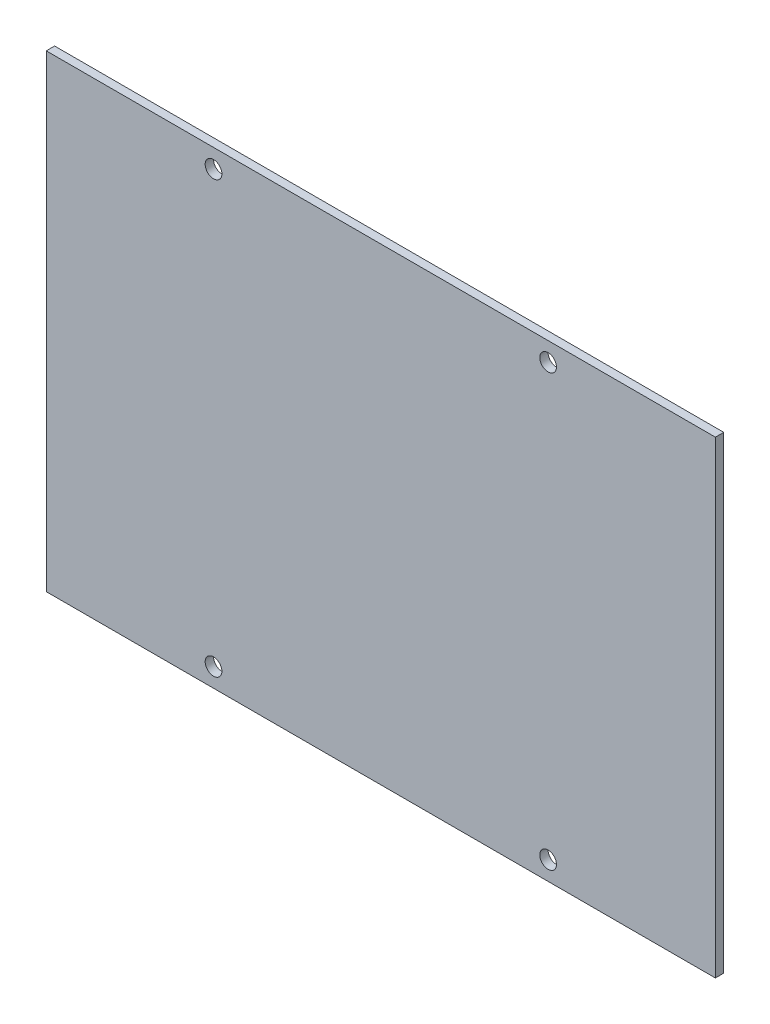
ISO-10303-21;
HEADER;
FILE_DESCRIPTION(('STEP AP214'),'2;1');
FILE_NAME('part.step','',(''),(''),'','','');
FILE_SCHEMA(('AUTOMOTIVE_DESIGN { 1 0 10303 214 1 1 1 1 }'));
ENDSEC;
DATA;
#1=APPLICATION_CONTEXT('core data for automotive mechanical design processes');
#2=APPLICATION_PROTOCOL_DEFINITION('international standard','automotive_design',2000,#1);
#3=PRODUCT_CONTEXT('',#1,'mechanical');
#4=PRODUCT('Part','Part','',(#3));
#5=PRODUCT_RELATED_PRODUCT_CATEGORY('part','',(#4));
#6=PRODUCT_DEFINITION_FORMATION('','',#4);
#7=PRODUCT_DEFINITION_CONTEXT('part definition',#1,'design');
#8=PRODUCT_DEFINITION('design','',#6,#7);
#9=PRODUCT_DEFINITION_SHAPE('','',#8);
#10=(LENGTH_UNIT() NAMED_UNIT(*) SI_UNIT(.MILLI.,.METRE.));
#11=(NAMED_UNIT(*) PLANE_ANGLE_UNIT() SI_UNIT($,.RADIAN.));
#12=(NAMED_UNIT(*) SI_UNIT($,.STERADIAN.) SOLID_ANGLE_UNIT());
#13=UNCERTAINTY_MEASURE_WITH_UNIT(LENGTH_MEASURE(1.E-05),#10,'distance_accuracy_value','');
#14=(GEOMETRIC_REPRESENTATION_CONTEXT(3) GLOBAL_UNCERTAINTY_ASSIGNED_CONTEXT((#13)) GLOBAL_UNIT_ASSIGNED_CONTEXT((#10,
#11,#12)) REPRESENTATION_CONTEXT('',''));
#15=CARTESIAN_POINT('',(0.,0.,0.));
#16=DIRECTION('',(0.,0.,1.));
#17=DIRECTION('',(1.,0.,0.));
#18=AXIS2_PLACEMENT_3D('',#15,#16,#17);
#19=CARTESIAN_POINT('',(0.,0.,2.));
#20=DIRECTION('',(1.,0.,0.));
#21=DIRECTION('',(0.,0.,-1.));
#22=AXIS2_PLACEMENT_3D('',#19,#20,#21);
#23=PLANE('',#22);
#24=DIRECTION('',(0.,-1.,0.));
#25=VECTOR('',#24,1.);
#26=CARTESIAN_POINT('',(0.,0.,0.));
#27=LINE('',#26,#25);
#28=CARTESIAN_POINT('',(0.,112.,0.));
#29=VERTEX_POINT('',#28);
#30=CARTESIAN_POINT('',(0.,0.,0.));
#31=VERTEX_POINT('',#30);
#32=EDGE_CURVE('E100',#29,#31,#27,.T.);
#33=ORIENTED_EDGE('',*,*,#32,.T.);
#34=DIRECTION('',(0.,0.,-1.));
#35=VECTOR('',#34,1.);
#36=CARTESIAN_POINT('',(0.,0.,2.));
#37=LINE('',#36,#35);
#38=CARTESIAN_POINT('',(0.,0.,2.));
#39=VERTEX_POINT('',#38);
#40=EDGE_CURVE('E11',#39,#31,#37,.T.);
#41=ORIENTED_EDGE('',*,*,#40,.F.);
#42=DIRECTION('',(0.,-1.,0.));
#43=VECTOR('',#42,1.);
#44=CARTESIAN_POINT('',(0.,0.,2.));
#45=LINE('',#44,#43);
#46=CARTESIAN_POINT('',(0.,112.,2.));
#47=VERTEX_POINT('',#46);
#48=EDGE_CURVE('E88',#47,#39,#45,.T.);
#49=ORIENTED_EDGE('',*,*,#48,.F.);
#50=DIRECTION('',(0.,0.,-1.));
#51=VECTOR('',#50,1.);
#52=CARTESIAN_POINT('',(0.,112.,2.));
#53=LINE('',#52,#51);
#54=EDGE_CURVE('E96',#47,#29,#53,.T.);
#55=ORIENTED_EDGE('',*,*,#54,.T.);
#56=EDGE_LOOP('',(#33,#41,#49,#55));
#57=FACE_BOUND('',#56,.T.);
#58=ADVANCED_FACE('F37',(#57),#23,.F.);
#59=CARTESIAN_POINT('',(0.,0.,2.));
#60=DIRECTION('',(0.,1.,0.));
#61=DIRECTION('',(0.,0.,1.));
#62=AXIS2_PLACEMENT_3D('',#59,#60,#61);
#63=PLANE('',#62);
#64=DIRECTION('',(1.,0.,0.));
#65=VECTOR('',#64,1.);
#66=CARTESIAN_POINT('',(0.,0.,0.));
#67=LINE('',#66,#65);
#68=CARTESIAN_POINT('',(160.,0.,0.));
#69=VERTEX_POINT('',#68);
#70=EDGE_CURVE('E92',#31,#69,#67,.T.);
#71=ORIENTED_EDGE('',*,*,#70,.T.);
#72=DIRECTION('',(0.,0.,-1.));
#73=VECTOR('',#72,1.);
#74=CARTESIAN_POINT('',(160.,0.,2.));
#75=LINE('',#74,#73);
#76=CARTESIAN_POINT('',(160.,0.,2.));
#77=VERTEX_POINT('',#76);
#78=EDGE_CURVE('E45',#77,#69,#75,.T.);
#79=ORIENTED_EDGE('',*,*,#78,.F.);
#80=DIRECTION('',(1.,0.,0.));
#81=VECTOR('',#80,1.);
#82=CARTESIAN_POINT('',(0.,0.,2.));
#83=LINE('',#82,#81);
#84=EDGE_CURVE('E83',#39,#77,#83,.T.);
#85=ORIENTED_EDGE('',*,*,#84,.F.);
#86=ORIENTED_EDGE('',*,*,#40,.T.);
#87=EDGE_LOOP('',(#71,#79,#85,#86));
#88=FACE_BOUND('',#87,.T.);
#89=ADVANCED_FACE('F91',(#88),#63,.F.);
#90=CARTESIAN_POINT('',(160.,0.,2.));
#91=DIRECTION('',(-1.,0.,0.));
#92=DIRECTION('',(0.,0.,1.));
#93=AXIS2_PLACEMENT_3D('',#90,#91,#92);
#94=PLANE('',#93);
#95=DIRECTION('',(0.,1.,0.));
#96=VECTOR('',#95,1.);
#97=CARTESIAN_POINT('',(160.,0.,0.));
#98=LINE('',#97,#96);
#99=CARTESIAN_POINT('',(160.,112.,0.));
#100=VERTEX_POINT('',#99);
#101=EDGE_CURVE('E70',#69,#100,#98,.T.);
#102=ORIENTED_EDGE('',*,*,#101,.T.);
#103=DIRECTION('',(0.,0.,-1.));
#104=VECTOR('',#103,1.);
#105=CARTESIAN_POINT('',(160.,112.,2.));
#106=LINE('',#105,#104);
#107=CARTESIAN_POINT('',(160.,112.,2.));
#108=VERTEX_POINT('',#107);
#109=EDGE_CURVE('E93',#108,#100,#106,.T.);
#110=ORIENTED_EDGE('',*,*,#109,.F.);
#111=DIRECTION('',(0.,1.,0.));
#112=VECTOR('',#111,1.);
#113=CARTESIAN_POINT('',(160.,0.,2.));
#114=LINE('',#113,#112);
#115=EDGE_CURVE('E86',#77,#108,#114,.T.);
#116=ORIENTED_EDGE('',*,*,#115,.F.);
#117=ORIENTED_EDGE('',*,*,#78,.T.);
#118=EDGE_LOOP('',(#102,#110,#116,#117));
#119=FACE_BOUND('',#118,.T.);
#120=ADVANCED_FACE('F94',(#119),#94,.F.);
#121=CARTESIAN_POINT('',(0.,112.,2.));
#122=DIRECTION('',(0.,-1.,0.));
#123=DIRECTION('',(0.,0.,-1.));
#124=AXIS2_PLACEMENT_3D('',#121,#122,#123);
#125=PLANE('',#124);
#126=DIRECTION('',(-1.,0.,0.));
#127=VECTOR('',#126,1.);
#128=CARTESIAN_POINT('',(0.,112.,0.));
#129=LINE('',#128,#127);
#130=EDGE_CURVE('E76',#100,#29,#129,.T.);
#131=ORIENTED_EDGE('',*,*,#130,.T.);
#132=ORIENTED_EDGE('',*,*,#54,.F.);
#133=DIRECTION('',(-1.,0.,0.));
#134=VECTOR('',#133,1.);
#135=CARTESIAN_POINT('',(0.,112.,2.));
#136=LINE('',#135,#134);
#137=EDGE_CURVE('E53',#108,#47,#136,.T.);
#138=ORIENTED_EDGE('',*,*,#137,.F.);
#139=ORIENTED_EDGE('',*,*,#109,.T.);
#140=EDGE_LOOP('',(#131,#132,#138,#139));
#141=FACE_BOUND('',#140,.T.);
#142=ADVANCED_FACE('F108',(#141),#125,.F.);
#143=CARTESIAN_POINT('',(0.,0.,2.));
#144=DIRECTION('',(0.,0.,-1.));
#145=DIRECTION('',(-1.,0.,0.));
#146=AXIS2_PLACEMENT_3D('',#143,#144,#145);
#147=PLANE('',#146);
#148=CARTESIAN_POINT('',(120.,107.5,2.));
#149=DIRECTION('',(0.,0.,1.));
#150=DIRECTION('',(1.,0.,0.));
#151=AXIS2_PLACEMENT_3D('',#148,#149,#150);
#152=CIRCLE('',#151,2.);
#153=CARTESIAN_POINT('',(122.,107.5,2.));
#154=VERTEX_POINT('',#153);
#155=EDGE_CURVE('E127',#154,#154,#152,.T.);
#156=ORIENTED_EDGE('',*,*,#155,.F.);
#157=EDGE_LOOP('',(#156));
#158=FACE_BOUND('',#157,.T.);
#159=CARTESIAN_POINT('',(40.,4.5,2.));
#160=DIRECTION('',(0.,0.,1.));
#161=DIRECTION('',(1.,0.,0.));
#162=AXIS2_PLACEMENT_3D('',#159,#160,#161);
#163=CIRCLE('',#162,2.);
#164=CARTESIAN_POINT('',(42.,4.5,2.));
#165=VERTEX_POINT('',#164);
#166=EDGE_CURVE('E120',#165,#165,#163,.T.);
#167=ORIENTED_EDGE('',*,*,#166,.F.);
#168=EDGE_LOOP('',(#167));
#169=FACE_BOUND('',#168,.T.);
#170=CARTESIAN_POINT('',(120.,4.5,2.));
#171=DIRECTION('',(0.,0.,1.));
#172=DIRECTION('',(1.,0.,0.));
#173=AXIS2_PLACEMENT_3D('',#170,#171,#172);
#174=CIRCLE('',#173,2.00000000000001);
#175=CARTESIAN_POINT('',(122.,4.5,2.));
#176=VERTEX_POINT('',#175);
#177=EDGE_CURVE('E132',#176,#176,#174,.T.);
#178=ORIENTED_EDGE('',*,*,#177,.F.);
#179=EDGE_LOOP('',(#178));
#180=FACE_BOUND('',#179,.T.);
#181=CARTESIAN_POINT('',(40.,107.5,2.));
#182=DIRECTION('',(0.,0.,1.));
#183=DIRECTION('',(1.,0.,0.));
#184=AXIS2_PLACEMENT_3D('',#181,#182,#183);
#185=CIRCLE('',#184,2.);
#186=CARTESIAN_POINT('',(42.,107.5,2.));
#187=VERTEX_POINT('',#186);
#188=EDGE_CURVE('E114',#187,#187,#185,.T.);
#189=ORIENTED_EDGE('',*,*,#188,.F.);
#190=EDGE_LOOP('',(#189));
#191=FACE_BOUND('',#190,.T.);
#192=ORIENTED_EDGE('',*,*,#48,.T.);
#193=ORIENTED_EDGE('',*,*,#84,.T.);
#194=ORIENTED_EDGE('',*,*,#115,.T.);
#195=ORIENTED_EDGE('',*,*,#137,.T.);
#196=EDGE_LOOP('',(#192,#193,#194,#195));
#197=FACE_BOUND('',#196,.T.);
#198=ADVANCED_FACE('F84',(#158,#169,#180,#191,#197),#147,.F.);
#199=CARTESIAN_POINT('',(0.,0.,0.));
#200=DIRECTION('',(0.,0.,-1.));
#201=DIRECTION('',(-1.,0.,0.));
#202=AXIS2_PLACEMENT_3D('',#199,#200,#201);
#203=PLANE('',#202);
#204=CARTESIAN_POINT('',(120.,107.5,0.));
#205=DIRECTION('',(0.,0.,1.));
#206=DIRECTION('',(1.,0.,0.));
#207=AXIS2_PLACEMENT_3D('',#204,#205,#206);
#208=CIRCLE('',#207,2.);
#209=CARTESIAN_POINT('',(122.,107.5,0.));
#210=VERTEX_POINT('',#209);
#211=EDGE_CURVE('E117',#210,#210,#208,.T.);
#212=ORIENTED_EDGE('',*,*,#211,.T.);
#213=EDGE_LOOP('',(#212));
#214=FACE_BOUND('',#213,.T.);
#215=CARTESIAN_POINT('',(40.,4.5,0.));
#216=DIRECTION('',(0.,0.,1.));
#217=DIRECTION('',(1.,0.,0.));
#218=AXIS2_PLACEMENT_3D('',#215,#216,#217);
#219=CIRCLE('',#218,2.);
#220=CARTESIAN_POINT('',(42.,4.5,0.));
#221=VERTEX_POINT('',#220);
#222=EDGE_CURVE('E123',#221,#221,#219,.T.);
#223=ORIENTED_EDGE('',*,*,#222,.T.);
#224=EDGE_LOOP('',(#223));
#225=FACE_BOUND('',#224,.T.);
#226=CARTESIAN_POINT('',(120.,4.5,0.));
#227=DIRECTION('',(0.,0.,1.));
#228=DIRECTION('',(1.,0.,0.));
#229=AXIS2_PLACEMENT_3D('',#226,#227,#228);
#230=CIRCLE('',#229,2.00000000000001);
#231=CARTESIAN_POINT('',(122.,4.5,0.));
#232=VERTEX_POINT('',#231);
#233=EDGE_CURVE('E124',#232,#232,#230,.T.);
#234=ORIENTED_EDGE('',*,*,#233,.T.);
#235=EDGE_LOOP('',(#234));
#236=FACE_BOUND('',#235,.T.);
#237=CARTESIAN_POINT('',(40.,107.5,0.));
#238=DIRECTION('',(0.,0.,1.));
#239=DIRECTION('',(1.,0.,0.));
#240=AXIS2_PLACEMENT_3D('',#237,#238,#239);
#241=CIRCLE('',#240,2.);
#242=CARTESIAN_POINT('',(42.,107.5,0.));
#243=VERTEX_POINT('',#242);
#244=EDGE_CURVE('E103',#243,#243,#241,.T.);
#245=ORIENTED_EDGE('',*,*,#244,.T.);
#246=EDGE_LOOP('',(#245));
#247=FACE_BOUND('',#246,.T.);
#248=ORIENTED_EDGE('',*,*,#32,.F.);
#249=ORIENTED_EDGE('',*,*,#130,.F.);
#250=ORIENTED_EDGE('',*,*,#101,.F.);
#251=ORIENTED_EDGE('',*,*,#70,.F.);
#252=EDGE_LOOP('',(#248,#249,#250,#251));
#253=FACE_BOUND('',#252,.T.);
#254=ADVANCED_FACE('F111',(#214,#225,#236,#247,#253),#203,.T.);
#255=CARTESIAN_POINT('',(40.,107.5,0.));
#256=DIRECTION('',(0.,0.,1.));
#257=DIRECTION('',(1.,0.,0.));
#258=AXIS2_PLACEMENT_3D('',#255,#256,#257);
#259=CYLINDRICAL_SURFACE('',#258,2.);
#260=ORIENTED_EDGE('',*,*,#244,.F.);
#261=EDGE_LOOP('',(#260));
#262=FACE_BOUND('',#261,.T.);
#263=ORIENTED_EDGE('',*,*,#188,.T.);
#264=EDGE_LOOP('',(#263));
#265=FACE_BOUND('',#264,.T.);
#266=ADVANCED_FACE('F144',(#262,#265),#259,.F.);
#267=CARTESIAN_POINT('',(120.,4.5,0.));
#268=DIRECTION('',(0.,0.,1.));
#269=DIRECTION('',(1.,0.,0.));
#270=AXIS2_PLACEMENT_3D('',#267,#268,#269);
#271=CYLINDRICAL_SURFACE('',#270,2.00000000000001);
#272=ORIENTED_EDGE('',*,*,#233,.F.);
#273=EDGE_LOOP('',(#272));
#274=FACE_BOUND('',#273,.T.);
#275=ORIENTED_EDGE('',*,*,#177,.T.);
#276=EDGE_LOOP('',(#275));
#277=FACE_BOUND('',#276,.T.);
#278=ADVANCED_FACE('F140',(#274,#277),#271,.F.);
#279=CARTESIAN_POINT('',(40.,4.5,0.));
#280=DIRECTION('',(0.,0.,1.));
#281=DIRECTION('',(1.,0.,0.));
#282=AXIS2_PLACEMENT_3D('',#279,#280,#281);
#283=CYLINDRICAL_SURFACE('',#282,2.);
#284=ORIENTED_EDGE('',*,*,#222,.F.);
#285=EDGE_LOOP('',(#284));
#286=FACE_BOUND('',#285,.T.);
#287=ORIENTED_EDGE('',*,*,#166,.T.);
#288=EDGE_LOOP('',(#287));
#289=FACE_BOUND('',#288,.T.);
#290=ADVANCED_FACE('F143',(#286,#289),#283,.F.);
#291=CARTESIAN_POINT('',(120.,107.5,0.));
#292=DIRECTION('',(0.,0.,1.));
#293=DIRECTION('',(1.,0.,0.));
#294=AXIS2_PLACEMENT_3D('',#291,#292,#293);
#295=CYLINDRICAL_SURFACE('',#294,2.);
#296=ORIENTED_EDGE('',*,*,#211,.F.);
#297=EDGE_LOOP('',(#296));
#298=FACE_BOUND('',#297,.T.);
#299=ORIENTED_EDGE('',*,*,#155,.T.);
#300=EDGE_LOOP('',(#299));
#301=FACE_BOUND('',#300,.T.);
#302=ADVANCED_FACE('F205',(#298,#301),#295,.F.);
#303=CLOSED_SHELL('',(#58,#89,#120,#142,#198,#254,#266,#278,#290,#302));
#304=MANIFOLD_SOLID_BREP('B2',#303);
#305=ADVANCED_BREP_SHAPE_REPRESENTATION('',(#18,#304),#14);
#306=SHAPE_DEFINITION_REPRESENTATION(#9,#305);
ENDSEC;
END-ISO-10303-21;
